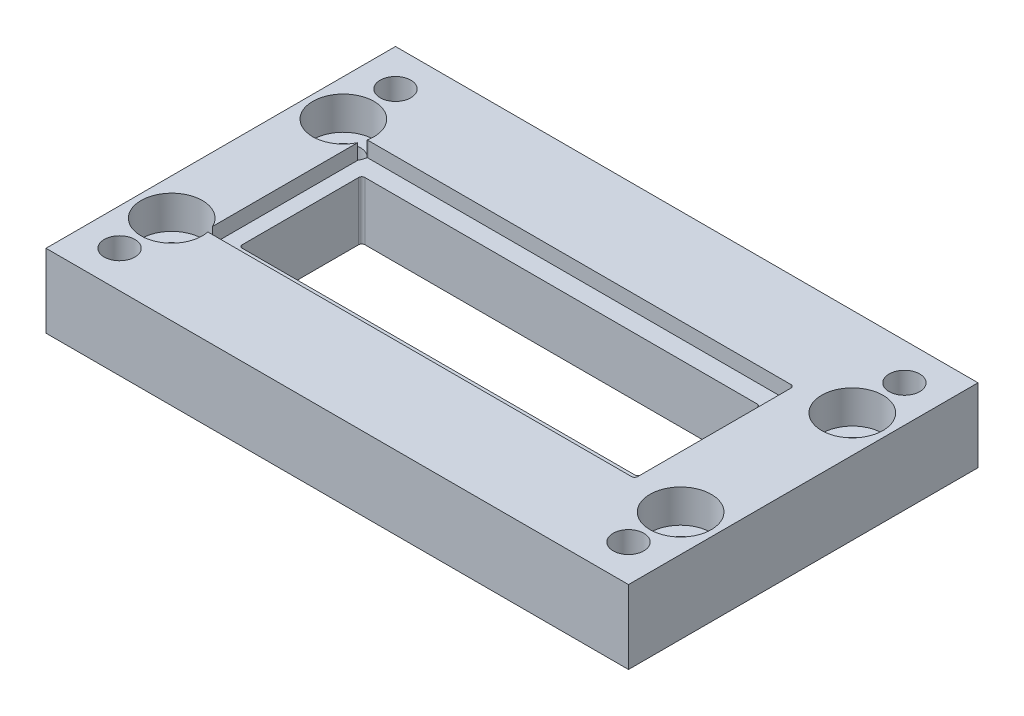
ISO-10303-21;
HEADER;
FILE_DESCRIPTION(('STEP AP214'),'2;1');
FILE_NAME('part.step','',(''),(''),'','','');
FILE_SCHEMA(('AUTOMOTIVE_DESIGN { 1 0 10303 214 1 1 1 1 }'));
ENDSEC;
DATA;
#1=APPLICATION_CONTEXT('core data for automotive mechanical design processes');
#2=APPLICATION_PROTOCOL_DEFINITION('international standard','automotive_design',2000,#1);
#3=PRODUCT_CONTEXT('',#1,'mechanical');
#4=PRODUCT('Part','Part','',(#3));
#5=PRODUCT_RELATED_PRODUCT_CATEGORY('part','',(#4));
#6=PRODUCT_DEFINITION_FORMATION('','',#4);
#7=PRODUCT_DEFINITION_CONTEXT('part definition',#1,'design');
#8=PRODUCT_DEFINITION('design','',#6,#7);
#9=PRODUCT_DEFINITION_SHAPE('','',#8);
#10=(LENGTH_UNIT() NAMED_UNIT(*) SI_UNIT(.MILLI.,.METRE.));
#11=(NAMED_UNIT(*) PLANE_ANGLE_UNIT() SI_UNIT($,.RADIAN.));
#12=(NAMED_UNIT(*) SI_UNIT($,.STERADIAN.) SOLID_ANGLE_UNIT());
#13=UNCERTAINTY_MEASURE_WITH_UNIT(LENGTH_MEASURE(1.E-05),#10,'distance_accuracy_value','');
#14=(GEOMETRIC_REPRESENTATION_CONTEXT(3) GLOBAL_UNCERTAINTY_ASSIGNED_CONTEXT((#13)) GLOBAL_UNIT_ASSIGNED_CONTEXT((#10,
#11,#12)) REPRESENTATION_CONTEXT('',''));
#15=CARTESIAN_POINT('',(0.,0.,0.));
#16=DIRECTION('',(0.,0.,1.));
#17=DIRECTION('',(1.,0.,0.));
#18=AXIS2_PLACEMENT_3D('',#15,#16,#17);
#19=CARTESIAN_POINT('',(-37.,12.,0.));
#20=DIRECTION('',(1.,0.,0.));
#21=DIRECTION('',(0.,0.,-1.));
#22=AXIS2_PLACEMENT_3D('',#19,#20,#21);
#23=PLANE('',#22);
#24=DIRECTION('',(0.,1.,0.));
#25=VECTOR('',#24,1.);
#26=CARTESIAN_POINT('',(-37.,12.,-11.8205505282297));
#27=LINE('',#26,#25);
#28=CARTESIAN_POINT('',(-37.,12.,-11.8205505282297));
#29=VERTEX_POINT('',#28);
#30=CARTESIAN_POINT('',(-37.,9.5,-11.8205505282297));
#31=VERTEX_POINT('',#30);
#32=EDGE_CURVE('E48',#29,#31,#27,.F.);
#33=ORIENTED_EDGE('',*,*,#32,.F.);
#34=DIRECTION('',(0.,0.,1.));
#35=VECTOR('',#34,1.);
#36=CARTESIAN_POINT('',(-37.,12.,0.));
#37=LINE('',#36,#35);
#38=CARTESIAN_POINT('',(-37.,12.,11.8205505282297));
#39=VERTEX_POINT('',#38);
#40=EDGE_CURVE('E55',#29,#39,#37,.T.);
#41=ORIENTED_EDGE('',*,*,#40,.T.);
#42=DIRECTION('',(0.,1.,0.));
#43=VECTOR('',#42,1.);
#44=CARTESIAN_POINT('',(-37.,12.,11.8205505282297));
#45=LINE('',#44,#43);
#46=CARTESIAN_POINT('',(-37.,9.5,11.8205505282297));
#47=VERTEX_POINT('',#46);
#48=EDGE_CURVE('E272',#47,#39,#45,.T.);
#49=ORIENTED_EDGE('',*,*,#48,.F.);
#50=DIRECTION('',(0.,0.,1.));
#51=VECTOR('',#50,1.);
#52=CARTESIAN_POINT('',(-37.,9.5,0.));
#53=LINE('',#52,#51);
#54=EDGE_CURVE('E191',#31,#47,#53,.T.);
#55=ORIENTED_EDGE('',*,*,#54,.F.);
#56=EDGE_LOOP('',(#33,#41,#49,#55));
#57=FACE_BOUND('',#56,.T.);
#58=ADVANCED_FACE('F34',(#57),#23,.T.);
#59=CARTESIAN_POINT('',(-36.5,12.,-12.5));
#60=DIRECTION('',(0.,-1.,0.));
#61=DIRECTION('',(0.,0.,-1.));
#62=AXIS2_PLACEMENT_3D('',#59,#60,#61);
#63=CYLINDRICAL_SURFACE('',#62,0.500000000000003);
#64=CARTESIAN_POINT('',(-36.5,12.,-12.5));
#65=DIRECTION('',(0.,1.,0.));
#66=DIRECTION('',(0.,0.,1.));
#67=AXIS2_PLACEMENT_3D('',#64,#65,#66);
#68=CIRCLE('',#67,0.500000000000003);
#69=CARTESIAN_POINT('',(-36.6032318616067,12.,-12.9892271279776));
#70=VERTEX_POINT('',#69);
#71=CARTESIAN_POINT('',(-36.5,12.,-13.));
#72=VERTEX_POINT('',#71);
#73=EDGE_CURVE('E199',#70,#72,#68,.F.);
#74=ORIENTED_EDGE('',*,*,#73,.F.);
#75=DIRECTION('',(0.,1.,0.));
#76=VECTOR('',#75,1.);
#77=CARTESIAN_POINT('',(-36.6032318616067,9.3,-12.9892271279776));
#78=LINE('',#77,#76);
#79=CARTESIAN_POINT('',(-36.6032318616067,9.5,-12.9892271279776));
#80=VERTEX_POINT('',#79);
#81=EDGE_CURVE('E184',#70,#80,#78,.F.);
#82=ORIENTED_EDGE('',*,*,#81,.T.);
#83=CARTESIAN_POINT('',(-36.5,9.5,-12.5));
#84=DIRECTION('',(0.,1.,0.));
#85=DIRECTION('',(0.,0.,1.));
#86=AXIS2_PLACEMENT_3D('',#83,#84,#85);
#87=CIRCLE('',#86,0.500000000000003);
#88=CARTESIAN_POINT('',(-36.5,9.5,-13.));
#89=VERTEX_POINT('',#88);
#90=EDGE_CURVE('E308',#80,#89,#87,.F.);
#91=ORIENTED_EDGE('',*,*,#90,.T.);
#92=DIRECTION('',(0.,-1.,0.));
#93=VECTOR('',#92,1.);
#94=CARTESIAN_POINT('',(-36.5,12.,-13.));
#95=LINE('',#94,#93);
#96=EDGE_CURVE('E255',#72,#89,#95,.T.);
#97=ORIENTED_EDGE('',*,*,#96,.F.);
#98=EDGE_LOOP('',(#74,#82,#91,#97));
#99=FACE_BOUND('',#98,.T.);
#100=ADVANCED_FACE('F436',(#99),#63,.F.);
#101=CARTESIAN_POINT('',(0.,12.,-13.));
#102=DIRECTION('',(0.,0.,1.));
#103=DIRECTION('',(1.,0.,0.));
#104=AXIS2_PLACEMENT_3D('',#101,#102,#103);
#105=PLANE('',#104);
#106=DIRECTION('',(-1.,0.,0.));
#107=VECTOR('',#106,1.);
#108=CARTESIAN_POINT('',(0.,9.5,-13.));
#109=LINE('',#108,#107);
#110=CARTESIAN_POINT('',(32.5,9.5,-13.));
#111=VERTEX_POINT('',#110);
#112=EDGE_CURVE('E324',#111,#89,#109,.T.);
#113=ORIENTED_EDGE('',*,*,#112,.F.);
#114=DIRECTION('',(0.,-1.,0.));
#115=VECTOR('',#114,1.);
#116=CARTESIAN_POINT('',(32.5,12.,-13.));
#117=LINE('',#116,#115);
#118=CARTESIAN_POINT('',(32.5,12.,-13.));
#119=VERTEX_POINT('',#118);
#120=EDGE_CURVE('E252',#119,#111,#117,.T.);
#121=ORIENTED_EDGE('',*,*,#120,.F.);
#122=DIRECTION('',(-1.,0.,0.));
#123=VECTOR('',#122,1.);
#124=CARTESIAN_POINT('',(0.,12.,-13.));
#125=LINE('',#124,#123);
#126=EDGE_CURVE('E202',#119,#72,#125,.T.);
#127=ORIENTED_EDGE('',*,*,#126,.T.);
#128=ORIENTED_EDGE('',*,*,#96,.T.);
#129=EDGE_LOOP('',(#113,#121,#127,#128));
#130=FACE_BOUND('',#129,.T.);
#131=ADVANCED_FACE('F441',(#130),#105,.T.);
#132=CARTESIAN_POINT('',(32.5,12.,-12.5));
#133=DIRECTION('',(0.,-1.,0.));
#134=DIRECTION('',(0.,0.,-1.));
#135=AXIS2_PLACEMENT_3D('',#132,#133,#134);
#136=CYLINDRICAL_SURFACE('',#135,0.5);
#137=ORIENTED_EDGE('',*,*,#120,.T.);
#138=CARTESIAN_POINT('',(32.5,9.5,-12.5));
#139=DIRECTION('',(0.,1.,0.));
#140=DIRECTION('',(0.,0.,1.));
#141=AXIS2_PLACEMENT_3D('',#138,#139,#140);
#142=CIRCLE('',#141,0.5);
#143=CARTESIAN_POINT('',(33.,9.5,-12.5));
#144=VERTEX_POINT('',#143);
#145=EDGE_CURVE('E321',#111,#144,#142,.F.);
#146=ORIENTED_EDGE('',*,*,#145,.T.);
#147=DIRECTION('',(0.,-1.,0.));
#148=VECTOR('',#147,1.);
#149=CARTESIAN_POINT('',(33.,12.,-12.5));
#150=LINE('',#149,#148);
#151=CARTESIAN_POINT('',(33.,12.,-12.5));
#152=VERTEX_POINT('',#151);
#153=EDGE_CURVE('E249',#152,#144,#150,.T.);
#154=ORIENTED_EDGE('',*,*,#153,.F.);
#155=CARTESIAN_POINT('',(32.5,12.,-12.5));
#156=DIRECTION('',(0.,1.,0.));
#157=DIRECTION('',(0.,0.,1.));
#158=AXIS2_PLACEMENT_3D('',#155,#156,#157);
#159=CIRCLE('',#158,0.5);
#160=EDGE_CURVE('E211',#119,#152,#159,.F.);
#161=ORIENTED_EDGE('',*,*,#160,.F.);
#162=EDGE_LOOP('',(#137,#146,#154,#161));
#163=FACE_BOUND('',#162,.T.);
#164=ADVANCED_FACE('F471',(#163),#136,.F.);
#165=CARTESIAN_POINT('',(33.,12.,0.));
#166=DIRECTION('',(1.,0.,0.));
#167=DIRECTION('',(0.,0.,-1.));
#168=AXIS2_PLACEMENT_3D('',#165,#166,#167);
#169=PLANE('',#168);
#170=ORIENTED_EDGE('',*,*,#153,.T.);
#171=DIRECTION('',(0.,0.,1.));
#172=VECTOR('',#171,1.);
#173=CARTESIAN_POINT('',(33.,9.5,0.));
#174=LINE('',#173,#172);
#175=CARTESIAN_POINT('',(33.,9.5,12.5));
#176=VERTEX_POINT('',#175);
#177=EDGE_CURVE('E318',#144,#176,#174,.T.);
#178=ORIENTED_EDGE('',*,*,#177,.T.);
#179=DIRECTION('',(0.,-1.,0.));
#180=VECTOR('',#179,1.);
#181=CARTESIAN_POINT('',(33.,12.,12.5));
#182=LINE('',#181,#180);
#183=CARTESIAN_POINT('',(33.,12.,12.5));
#184=VERTEX_POINT('',#183);
#185=EDGE_CURVE('E246',#184,#176,#182,.T.);
#186=ORIENTED_EDGE('',*,*,#185,.F.);
#187=DIRECTION('',(0.,0.,1.));
#188=VECTOR('',#187,1.);
#189=CARTESIAN_POINT('',(33.,12.,0.));
#190=LINE('',#189,#188);
#191=EDGE_CURVE('E214',#152,#184,#190,.T.);
#192=ORIENTED_EDGE('',*,*,#191,.F.);
#193=EDGE_LOOP('',(#170,#178,#186,#192));
#194=FACE_BOUND('',#193,.T.);
#195=ADVANCED_FACE('F464',(#194),#169,.F.);
#196=CARTESIAN_POINT('',(32.5,12.,12.5));
#197=DIRECTION('',(0.,-1.,0.));
#198=DIRECTION('',(0.,0.,-1.));
#199=AXIS2_PLACEMENT_3D('',#196,#197,#198);
#200=CYLINDRICAL_SURFACE('',#199,0.5);
#201=CARTESIAN_POINT('',(32.5,9.5,12.5));
#202=DIRECTION('',(0.,1.,0.));
#203=DIRECTION('',(0.,0.,1.));
#204=AXIS2_PLACEMENT_3D('',#201,#202,#203);
#205=CIRCLE('',#204,0.5);
#206=CARTESIAN_POINT('',(32.5,9.5,13.));
#207=VERTEX_POINT('',#206);
#208=EDGE_CURVE('E316',#207,#176,#205,.T.);
#209=ORIENTED_EDGE('',*,*,#208,.F.);
#210=DIRECTION('',(0.,-1.,0.));
#211=VECTOR('',#210,1.);
#212=CARTESIAN_POINT('',(32.5,12.,13.));
#213=LINE('',#212,#211);
#214=CARTESIAN_POINT('',(32.5,12.,13.));
#215=VERTEX_POINT('',#214);
#216=EDGE_CURVE('E242',#215,#207,#213,.T.);
#217=ORIENTED_EDGE('',*,*,#216,.F.);
#218=CARTESIAN_POINT('',(32.5,12.,12.5));
#219=DIRECTION('',(0.,1.,0.));
#220=DIRECTION('',(0.,0.,1.));
#221=AXIS2_PLACEMENT_3D('',#218,#219,#220);
#222=CIRCLE('',#221,0.5);
#223=EDGE_CURVE('E216',#215,#184,#222,.T.);
#224=ORIENTED_EDGE('',*,*,#223,.T.);
#225=ORIENTED_EDGE('',*,*,#185,.T.);
#226=EDGE_LOOP('',(#209,#217,#224,#225));
#227=FACE_BOUND('',#226,.T.);
#228=ADVANCED_FACE('F458',(#227),#200,.F.);
#229=CARTESIAN_POINT('',(0.,12.,13.));
#230=DIRECTION('',(0.,0.,1.));
#231=DIRECTION('',(1.,0.,0.));
#232=AXIS2_PLACEMENT_3D('',#229,#230,#231);
#233=PLANE('',#232);
#234=ORIENTED_EDGE('',*,*,#216,.T.);
#235=DIRECTION('',(-1.,0.,0.));
#236=VECTOR('',#235,1.);
#237=CARTESIAN_POINT('',(0.,9.5,13.));
#238=LINE('',#237,#236);
#239=CARTESIAN_POINT('',(-36.5,9.5,13.));
#240=VERTEX_POINT('',#239);
#241=EDGE_CURVE('E313',#207,#240,#238,.T.);
#242=ORIENTED_EDGE('',*,*,#241,.T.);
#243=DIRECTION('',(0.,-1.,0.));
#244=VECTOR('',#243,1.);
#245=CARTESIAN_POINT('',(-36.5,12.,13.));
#246=LINE('',#245,#244);
#247=CARTESIAN_POINT('',(-36.5,12.,13.));
#248=VERTEX_POINT('',#247);
#249=EDGE_CURVE('E239',#248,#240,#246,.T.);
#250=ORIENTED_EDGE('',*,*,#249,.F.);
#251=DIRECTION('',(-1.,0.,0.));
#252=VECTOR('',#251,1.);
#253=CARTESIAN_POINT('',(0.,12.,13.));
#254=LINE('',#253,#252);
#255=EDGE_CURVE('E219',#215,#248,#254,.T.);
#256=ORIENTED_EDGE('',*,*,#255,.F.);
#257=EDGE_LOOP('',(#234,#242,#250,#256));
#258=FACE_BOUND('',#257,.T.);
#259=ADVANCED_FACE('F454',(#258),#233,.F.);
#260=CARTESIAN_POINT('',(0.,12.,-28.5));
#261=DIRECTION('',(0.,0.,1.));
#262=DIRECTION('',(1.,0.,0.));
#263=AXIS2_PLACEMENT_3D('',#260,#261,#262);
#264=PLANE('',#263);
#265=DIRECTION('',(-1.,0.,0.));
#266=VECTOR('',#265,1.);
#267=CARTESIAN_POINT('',(0.,0.,-28.5));
#268=LINE('',#267,#266);
#269=CARTESIAN_POINT('',(47.5,0.,-28.5));
#270=VERTEX_POINT('',#269);
#271=CARTESIAN_POINT('',(-47.5,0.,-28.5));
#272=VERTEX_POINT('',#271);
#273=EDGE_CURVE('E225',#270,#272,#268,.T.);
#274=ORIENTED_EDGE('',*,*,#273,.T.);
#275=DIRECTION('',(0.,-1.,0.));
#276=VECTOR('',#275,1.);
#277=CARTESIAN_POINT('',(-47.5,12.,-28.5));
#278=LINE('',#277,#276);
#279=CARTESIAN_POINT('',(-47.5,12.,-28.5));
#280=VERTEX_POINT('',#279);
#281=EDGE_CURVE('E243',#280,#272,#278,.T.);
#282=ORIENTED_EDGE('',*,*,#281,.F.);
#283=DIRECTION('',(-1.,0.,0.));
#284=VECTOR('',#283,1.);
#285=CARTESIAN_POINT('',(0.,12.,-28.5));
#286=LINE('',#285,#284);
#287=CARTESIAN_POINT('',(47.5,12.,-28.5));
#288=VERTEX_POINT('',#287);
#289=EDGE_CURVE('E238',#288,#280,#286,.T.);
#290=ORIENTED_EDGE('',*,*,#289,.F.);
#291=DIRECTION('',(0.,-1.,0.));
#292=VECTOR('',#291,1.);
#293=CARTESIAN_POINT('',(47.5,12.,-28.5));
#294=LINE('',#293,#292);
#295=EDGE_CURVE('E224',#288,#270,#294,.T.);
#296=ORIENTED_EDGE('',*,*,#295,.T.);
#297=EDGE_LOOP('',(#274,#282,#290,#296));
#298=FACE_BOUND('',#297,.T.);
#299=ADVANCED_FACE('F36',(#298),#264,.F.);
#300=CARTESIAN_POINT('',(-47.5,12.,0.));
#301=DIRECTION('',(1.,0.,0.));
#302=DIRECTION('',(0.,0.,-1.));
#303=AXIS2_PLACEMENT_3D('',#300,#301,#302);
#304=PLANE('',#303);
#305=DIRECTION('',(0.,0.,1.));
#306=VECTOR('',#305,1.);
#307=CARTESIAN_POINT('',(-47.5,0.,0.));
#308=LINE('',#307,#306);
#309=CARTESIAN_POINT('',(-47.5,0.,28.5));
#310=VERTEX_POINT('',#309);
#311=EDGE_CURVE('E228',#272,#310,#308,.T.);
#312=ORIENTED_EDGE('',*,*,#311,.T.);
#313=DIRECTION('',(0.,-1.,0.));
#314=VECTOR('',#313,1.);
#315=CARTESIAN_POINT('',(-47.5,12.,28.5));
#316=LINE('',#315,#314);
#317=CARTESIAN_POINT('',(-47.5,12.,28.5));
#318=VERTEX_POINT('',#317);
#319=EDGE_CURVE('E261',#318,#310,#316,.T.);
#320=ORIENTED_EDGE('',*,*,#319,.F.);
#321=DIRECTION('',(0.,0.,1.));
#322=VECTOR('',#321,1.);
#323=CARTESIAN_POINT('',(-47.5,12.,0.));
#324=LINE('',#323,#322);
#325=EDGE_CURVE('E363',#280,#318,#324,.T.);
#326=ORIENTED_EDGE('',*,*,#325,.F.);
#327=ORIENTED_EDGE('',*,*,#281,.T.);
#328=EDGE_LOOP('',(#312,#320,#326,#327));
#329=FACE_BOUND('',#328,.T.);
#330=ADVANCED_FACE('F380',(#329),#304,.F.);
#331=CARTESIAN_POINT('',(0.,12.,28.5));
#332=DIRECTION('',(0.,0.,1.));
#333=DIRECTION('',(1.,0.,0.));
#334=AXIS2_PLACEMENT_3D('',#331,#332,#333);
#335=PLANE('',#334);
#336=DIRECTION('',(-1.,0.,0.));
#337=VECTOR('',#336,1.);
#338=CARTESIAN_POINT('',(0.,0.,28.5));
#339=LINE('',#338,#337);
#340=CARTESIAN_POINT('',(47.5,0.,28.5));
#341=VERTEX_POINT('',#340);
#342=EDGE_CURVE('E232',#341,#310,#339,.T.);
#343=ORIENTED_EDGE('',*,*,#342,.F.);
#344=DIRECTION('',(0.,-1.,0.));
#345=VECTOR('',#344,1.);
#346=CARTESIAN_POINT('',(47.5,12.,28.5));
#347=LINE('',#346,#345);
#348=CARTESIAN_POINT('',(47.5,12.,28.5));
#349=VERTEX_POINT('',#348);
#350=EDGE_CURVE('E259',#349,#341,#347,.T.);
#351=ORIENTED_EDGE('',*,*,#350,.F.);
#352=DIRECTION('',(-1.,0.,0.));
#353=VECTOR('',#352,1.);
#354=CARTESIAN_POINT('',(0.,12.,28.5));
#355=LINE('',#354,#353);
#356=EDGE_CURVE('E205',#349,#318,#355,.T.);
#357=ORIENTED_EDGE('',*,*,#356,.T.);
#358=ORIENTED_EDGE('',*,*,#319,.T.);
#359=EDGE_LOOP('',(#343,#351,#357,#358));
#360=FACE_BOUND('',#359,.T.);
#361=ADVANCED_FACE('F368',(#360),#335,.T.);
#362=CARTESIAN_POINT('',(47.5,12.,0.));
#363=DIRECTION('',(1.,0.,0.));
#364=DIRECTION('',(0.,0.,-1.));
#365=AXIS2_PLACEMENT_3D('',#362,#363,#364);
#366=PLANE('',#365);
#367=DIRECTION('',(0.,0.,1.));
#368=VECTOR('',#367,1.);
#369=CARTESIAN_POINT('',(47.5,0.,0.));
#370=LINE('',#369,#368);
#371=EDGE_CURVE('E235',#270,#341,#370,.T.);
#372=ORIENTED_EDGE('',*,*,#371,.F.);
#373=ORIENTED_EDGE('',*,*,#295,.F.);
#374=DIRECTION('',(0.,0.,1.));
#375=VECTOR('',#374,1.);
#376=CARTESIAN_POINT('',(47.5,12.,0.));
#377=LINE('',#376,#375);
#378=EDGE_CURVE('E200',#288,#349,#377,.T.);
#379=ORIENTED_EDGE('',*,*,#378,.T.);
#380=ORIENTED_EDGE('',*,*,#350,.T.);
#381=EDGE_LOOP('',(#372,#373,#379,#380));
#382=FACE_BOUND('',#381,.T.);
#383=ADVANCED_FACE('F374',(#382),#366,.T.);
#384=CARTESIAN_POINT('',(-36.5,12.,12.5));
#385=DIRECTION('',(0.,-1.,0.));
#386=DIRECTION('',(0.,0.,-1.));
#387=AXIS2_PLACEMENT_3D('',#384,#385,#386);
#388=CYLINDRICAL_SURFACE('',#387,0.5);
#389=CARTESIAN_POINT('',(-36.5,9.5,12.5));
#390=DIRECTION('',(0.,1.,0.));
#391=DIRECTION('',(0.,0.,1.));
#392=AXIS2_PLACEMENT_3D('',#389,#390,#391);
#393=CIRCLE('',#392,0.5);
#394=CARTESIAN_POINT('',(-36.6032318616067,9.5,12.9892271279776));
#395=VERTEX_POINT('',#394);
#396=EDGE_CURVE('E311',#240,#395,#393,.F.);
#397=ORIENTED_EDGE('',*,*,#396,.T.);
#398=DIRECTION('',(0.,1.,0.));
#399=VECTOR('',#398,1.);
#400=CARTESIAN_POINT('',(-36.6032318616067,9.3,12.9892271279776));
#401=LINE('',#400,#399);
#402=CARTESIAN_POINT('',(-36.6032318616067,12.,12.9892271279776));
#403=VERTEX_POINT('',#402);
#404=EDGE_CURVE('E265',#395,#403,#401,.T.);
#405=ORIENTED_EDGE('',*,*,#404,.T.);
#406=CARTESIAN_POINT('',(-36.5,12.,12.5));
#407=DIRECTION('',(0.,1.,0.));
#408=DIRECTION('',(0.,0.,1.));
#409=AXIS2_PLACEMENT_3D('',#406,#407,#408);
#410=CIRCLE('',#409,0.5);
#411=EDGE_CURVE('E222',#248,#403,#410,.F.);
#412=ORIENTED_EDGE('',*,*,#411,.F.);
#413=ORIENTED_EDGE('',*,*,#249,.T.);
#414=EDGE_LOOP('',(#397,#405,#412,#413));
#415=FACE_BOUND('',#414,.T.);
#416=ADVANCED_FACE('F448',(#415),#388,.F.);
#417=CARTESIAN_POINT('',(0.,12.,0.));
#418=DIRECTION('',(0.,1.,0.));
#419=DIRECTION('',(0.,0.,1.));
#420=AXIS2_PLACEMENT_3D('',#417,#418,#419);
#421=PLANE('',#420);
#422=CARTESIAN_POINT('',(-41.5,12.,-22.5));
#423=DIRECTION('',(0.,1.,0.));
#424=DIRECTION('',(0.,0.,1.));
#425=AXIS2_PLACEMENT_3D('',#422,#423,#424);
#426=CIRCLE('',#425,2.5);
#427=CARTESIAN_POINT('',(-41.5,12.,-20.));
#428=VERTEX_POINT('',#427);
#429=EDGE_CURVE('E586',#428,#428,#426,.T.);
#430=ORIENTED_EDGE('',*,*,#429,.F.);
#431=EDGE_LOOP('',(#430));
#432=FACE_BOUND('',#431,.T.);
#433=CARTESIAN_POINT('',(41.5,12.,-22.5));
#434=DIRECTION('',(0.,1.,0.));
#435=DIRECTION('',(0.,0.,1.));
#436=AXIS2_PLACEMENT_3D('',#433,#434,#435);
#437=CIRCLE('',#436,2.5);
#438=CARTESIAN_POINT('',(41.5,12.,-20.));
#439=VERTEX_POINT('',#438);
#440=EDGE_CURVE('E589',#439,#439,#437,.T.);
#441=ORIENTED_EDGE('',*,*,#440,.F.);
#442=EDGE_LOOP('',(#441));
#443=FACE_BOUND('',#442,.T.);
#444=CARTESIAN_POINT('',(41.5,12.,22.5));
#445=DIRECTION('',(0.,1.,0.));
#446=DIRECTION('',(0.,0.,1.));
#447=AXIS2_PLACEMENT_3D('',#444,#445,#446);
#448=CIRCLE('',#447,2.5);
#449=CARTESIAN_POINT('',(41.5,12.,25.));
#450=VERTEX_POINT('',#449);
#451=EDGE_CURVE('E597',#450,#450,#448,.T.);
#452=ORIENTED_EDGE('',*,*,#451,.F.);
#453=EDGE_LOOP('',(#452));
#454=FACE_BOUND('',#453,.T.);
#455=CARTESIAN_POINT('',(-41.5,12.,22.5));
#456=DIRECTION('',(0.,1.,0.));
#457=DIRECTION('',(0.,0.,1.));
#458=AXIS2_PLACEMENT_3D('',#455,#456,#457);
#459=CIRCLE('',#458,2.5);
#460=CARTESIAN_POINT('',(-41.5,12.,25.));
#461=VERTEX_POINT('',#460);
#462=EDGE_CURVE('E603',#461,#461,#459,.T.);
#463=ORIENTED_EDGE('',*,*,#462,.F.);
#464=EDGE_LOOP('',(#463));
#465=FACE_BOUND('',#464,.T.);
#466=CARTESIAN_POINT('',(-41.5,12.,-14.));
#467=DIRECTION('',(0.,1.,0.));
#468=DIRECTION('',(0.,0.,1.));
#469=AXIS2_PLACEMENT_3D('',#466,#467,#468);
#470=CIRCLE('',#469,5.);
#471=EDGE_CURVE('E181',#70,#29,#470,.T.);
#472=ORIENTED_EDGE('',*,*,#471,.F.);
#473=ORIENTED_EDGE('',*,*,#73,.T.);
#474=ORIENTED_EDGE('',*,*,#126,.F.);
#475=ORIENTED_EDGE('',*,*,#160,.T.);
#476=ORIENTED_EDGE('',*,*,#191,.T.);
#477=ORIENTED_EDGE('',*,*,#223,.F.);
#478=ORIENTED_EDGE('',*,*,#255,.T.);
#479=ORIENTED_EDGE('',*,*,#411,.T.);
#480=CARTESIAN_POINT('',(-41.5,12.,14.));
#481=DIRECTION('',(0.,1.,0.));
#482=DIRECTION('',(0.,0.,1.));
#483=AXIS2_PLACEMENT_3D('',#480,#481,#482);
#484=CIRCLE('',#483,5.);
#485=EDGE_CURVE('E198',#39,#403,#484,.T.);
#486=ORIENTED_EDGE('',*,*,#485,.F.);
#487=ORIENTED_EDGE('',*,*,#40,.F.);
#488=EDGE_LOOP('',(#472,#473,#474,#475,#476,#477,#478,#479,#486,#487));
#489=FACE_BOUND('',#488,.T.);
#490=CARTESIAN_POINT('',(41.5,12.,-14.));
#491=DIRECTION('',(0.,1.,0.));
#492=DIRECTION('',(0.,0.,1.));
#493=AXIS2_PLACEMENT_3D('',#490,#491,#492);
#494=CIRCLE('',#493,5.);
#495=CARTESIAN_POINT('',(41.5,12.,-9.00000000000001));
#496=VERTEX_POINT('',#495);
#497=EDGE_CURVE('E485',#496,#496,#494,.T.);
#498=ORIENTED_EDGE('',*,*,#497,.F.);
#499=EDGE_LOOP('',(#498));
#500=FACE_BOUND('',#499,.T.);
#501=CARTESIAN_POINT('',(41.5,12.,14.));
#502=DIRECTION('',(0.,1.,0.));
#503=DIRECTION('',(0.,0.,1.));
#504=AXIS2_PLACEMENT_3D('',#501,#502,#503);
#505=CIRCLE('',#504,5.);
#506=CARTESIAN_POINT('',(41.5,12.,19.));
#507=VERTEX_POINT('',#506);
#508=EDGE_CURVE('E500',#507,#507,#505,.T.);
#509=ORIENTED_EDGE('',*,*,#508,.F.);
#510=EDGE_LOOP('',(#509));
#511=FACE_BOUND('',#510,.T.);
#512=ORIENTED_EDGE('',*,*,#289,.T.);
#513=ORIENTED_EDGE('',*,*,#325,.T.);
#514=ORIENTED_EDGE('',*,*,#356,.F.);
#515=ORIENTED_EDGE('',*,*,#378,.F.);
#516=EDGE_LOOP('',(#512,#513,#514,#515));
#517=FACE_BOUND('',#516,.T.);
#518=ADVANCED_FACE('F195',(#432,#443,#454,#465,#489,#500,#511,#517),#421,.T.);
#519=CARTESIAN_POINT('',(0.,0.,0.));
#520=DIRECTION('',(0.,1.,0.));
#521=DIRECTION('',(0.,0.,1.));
#522=AXIS2_PLACEMENT_3D('',#519,#520,#521);
#523=PLANE('',#522);
#524=CARTESIAN_POINT('',(-41.5,0.,-22.5));
#525=DIRECTION('',(0.,1.,0.));
#526=DIRECTION('',(0.,0.,1.));
#527=AXIS2_PLACEMENT_3D('',#524,#525,#526);
#528=CIRCLE('',#527,2.5);
#529=CARTESIAN_POINT('',(-41.5,0.,-20.));
#530=VERTEX_POINT('',#529);
#531=EDGE_CURVE('E583',#530,#530,#528,.T.);
#532=ORIENTED_EDGE('',*,*,#531,.T.);
#533=EDGE_LOOP('',(#532));
#534=FACE_BOUND('',#533,.T.);
#535=CARTESIAN_POINT('',(41.5,0.,-22.5));
#536=DIRECTION('',(0.,1.,0.));
#537=DIRECTION('',(0.,0.,1.));
#538=AXIS2_PLACEMENT_3D('',#535,#536,#537);
#539=CIRCLE('',#538,2.5);
#540=CARTESIAN_POINT('',(41.5,0.,-20.));
#541=VERTEX_POINT('',#540);
#542=EDGE_CURVE('E594',#541,#541,#539,.T.);
#543=ORIENTED_EDGE('',*,*,#542,.T.);
#544=EDGE_LOOP('',(#543));
#545=FACE_BOUND('',#544,.T.);
#546=CARTESIAN_POINT('',(41.5,0.,22.5));
#547=DIRECTION('',(0.,1.,0.));
#548=DIRECTION('',(0.,0.,1.));
#549=AXIS2_PLACEMENT_3D('',#546,#547,#548);
#550=CIRCLE('',#549,2.5);
#551=CARTESIAN_POINT('',(41.5,0.,25.));
#552=VERTEX_POINT('',#551);
#553=EDGE_CURVE('E600',#552,#552,#550,.T.);
#554=ORIENTED_EDGE('',*,*,#553,.T.);
#555=EDGE_LOOP('',(#554));
#556=FACE_BOUND('',#555,.T.);
#557=CARTESIAN_POINT('',(-41.5,0.,22.5));
#558=DIRECTION('',(0.,1.,0.));
#559=DIRECTION('',(0.,0.,1.));
#560=AXIS2_PLACEMENT_3D('',#557,#558,#559);
#561=CIRCLE('',#560,2.5);
#562=CARTESIAN_POINT('',(-41.5,0.,25.));
#563=VERTEX_POINT('',#562);
#564=EDGE_CURVE('E188',#563,#563,#561,.T.);
#565=ORIENTED_EDGE('',*,*,#564,.T.);
#566=EDGE_LOOP('',(#565));
#567=FACE_BOUND('',#566,.T.);
#568=CARTESIAN_POINT('',(-41.5,0.,-14.));
#569=DIRECTION('',(0.,1.,0.));
#570=DIRECTION('',(0.,0.,1.));
#571=AXIS2_PLACEMENT_3D('',#568,#569,#570);
#572=CIRCLE('',#571,2.75);
#573=CARTESIAN_POINT('',(-41.5,0.,-11.25));
#574=VERTEX_POINT('',#573);
#575=EDGE_CURVE('E192',#574,#574,#572,.T.);
#576=ORIENTED_EDGE('',*,*,#575,.T.);
#577=EDGE_LOOP('',(#576));
#578=FACE_BOUND('',#577,.T.);
#579=CARTESIAN_POINT('',(41.5,0.,-14.));
#580=DIRECTION('',(0.,1.,0.));
#581=DIRECTION('',(0.,0.,1.));
#582=AXIS2_PLACEMENT_3D('',#579,#580,#581);
#583=CIRCLE('',#582,2.75);
#584=CARTESIAN_POINT('',(41.5,0.,-11.25));
#585=VERTEX_POINT('',#584);
#586=EDGE_CURVE('E497',#585,#585,#583,.T.);
#587=ORIENTED_EDGE('',*,*,#586,.T.);
#588=EDGE_LOOP('',(#587));
#589=FACE_BOUND('',#588,.T.);
#590=CARTESIAN_POINT('',(41.5,0.,14.));
#591=DIRECTION('',(0.,1.,0.));
#592=DIRECTION('',(0.,0.,1.));
#593=AXIS2_PLACEMENT_3D('',#590,#591,#592);
#594=CIRCLE('',#593,2.75);
#595=CARTESIAN_POINT('',(41.5,0.,16.75));
#596=VERTEX_POINT('',#595);
#597=EDGE_CURVE('E509',#596,#596,#594,.T.);
#598=ORIENTED_EDGE('',*,*,#597,.T.);
#599=EDGE_LOOP('',(#598));
#600=FACE_BOUND('',#599,.T.);
#601=CARTESIAN_POINT('',(-41.5,0.,14.));
#602=DIRECTION('',(0.,1.,0.));
#603=DIRECTION('',(0.,0.,1.));
#604=AXIS2_PLACEMENT_3D('',#601,#602,#603);
#605=CIRCLE('',#604,2.75);
#606=CARTESIAN_POINT('',(-41.5,0.,16.75));
#607=VERTEX_POINT('',#606);
#608=EDGE_CURVE('E276',#607,#607,#605,.T.);
#609=ORIENTED_EDGE('',*,*,#608,.T.);
#610=EDGE_LOOP('',(#609));
#611=FACE_BOUND('',#610,.T.);
#612=ORIENTED_EDGE('',*,*,#273,.F.);
#613=ORIENTED_EDGE('',*,*,#371,.T.);
#614=ORIENTED_EDGE('',*,*,#342,.T.);
#615=ORIENTED_EDGE('',*,*,#311,.F.);
#616=EDGE_LOOP('',(#612,#613,#614,#615));
#617=FACE_BOUND('',#616,.T.);
#618=CARTESIAN_POINT('',(30.,0.,9.49999999999999));
#619=DIRECTION('',(0.,1.,0.));
#620=DIRECTION('',(0.,0.,1.));
#621=AXIS2_PLACEMENT_3D('',#618,#619,#620);
#622=CIRCLE('',#621,0.5);
#623=CARTESIAN_POINT('',(30.,0.,9.99999999999999));
#624=VERTEX_POINT('',#623);
#625=CARTESIAN_POINT('',(30.5,0.,9.49999999999999));
#626=VERTEX_POINT('',#625);
#627=EDGE_CURVE('E275',#624,#626,#622,.T.);
#628=ORIENTED_EDGE('',*,*,#627,.T.);
#629=DIRECTION('',(0.,0.,-1.));
#630=VECTOR('',#629,1.);
#631=CARTESIAN_POINT('',(30.5,0.,0.));
#632=LINE('',#631,#630);
#633=CARTESIAN_POINT('',(30.5,0.,-9.5));
#634=VERTEX_POINT('',#633);
#635=EDGE_CURVE('E290',#626,#634,#632,.T.);
#636=ORIENTED_EDGE('',*,*,#635,.T.);
#637=CARTESIAN_POINT('',(30.,0.,-9.50000000000001));
#638=DIRECTION('',(0.,1.,0.));
#639=DIRECTION('',(0.,0.,1.));
#640=AXIS2_PLACEMENT_3D('',#637,#638,#639);
#641=CIRCLE('',#640,0.5);
#642=CARTESIAN_POINT('',(30.,0.,-10.));
#643=VERTEX_POINT('',#642);
#644=EDGE_CURVE('E340',#634,#643,#641,.T.);
#645=ORIENTED_EDGE('',*,*,#644,.T.);
#646=DIRECTION('',(-1.,0.,0.));
#647=VECTOR('',#646,1.);
#648=CARTESIAN_POINT('',(0.,0.,-10.));
#649=LINE('',#648,#647);
#650=CARTESIAN_POINT('',(-34.,0.,-10.));
#651=VERTEX_POINT('',#650);
#652=EDGE_CURVE('E337',#643,#651,#649,.T.);
#653=ORIENTED_EDGE('',*,*,#652,.T.);
#654=CARTESIAN_POINT('',(-34.,0.,-9.5));
#655=DIRECTION('',(0.,1.,0.));
#656=DIRECTION('',(0.,0.,1.));
#657=AXIS2_PLACEMENT_3D('',#654,#655,#656);
#658=CIRCLE('',#657,0.5);
#659=CARTESIAN_POINT('',(-34.5,0.,-9.49999999999999));
#660=VERTEX_POINT('',#659);
#661=EDGE_CURVE('E334',#651,#660,#658,.T.);
#662=ORIENTED_EDGE('',*,*,#661,.T.);
#663=DIRECTION('',(0.,0.,-1.));
#664=VECTOR('',#663,1.);
#665=CARTESIAN_POINT('',(-34.5,0.,0.));
#666=LINE('',#665,#664);
#667=CARTESIAN_POINT('',(-34.5,0.,9.5));
#668=VERTEX_POINT('',#667);
#669=EDGE_CURVE('E331',#668,#660,#666,.T.);
#670=ORIENTED_EDGE('',*,*,#669,.F.);
#671=CARTESIAN_POINT('',(-34.,0.,9.5));
#672=DIRECTION('',(0.,1.,0.));
#673=DIRECTION('',(0.,0.,1.));
#674=AXIS2_PLACEMENT_3D('',#671,#672,#673);
#675=CIRCLE('',#674,0.5);
#676=CARTESIAN_POINT('',(-34.,0.,10.));
#677=VERTEX_POINT('',#676);
#678=EDGE_CURVE('E329',#677,#668,#675,.F.);
#679=ORIENTED_EDGE('',*,*,#678,.F.);
#680=DIRECTION('',(-1.,0.,0.));
#681=VECTOR('',#680,1.);
#682=CARTESIAN_POINT('',(0.,0.,10.));
#683=LINE('',#682,#681);
#684=EDGE_CURVE('E279',#624,#677,#683,.T.);
#685=ORIENTED_EDGE('',*,*,#684,.F.);
#686=EDGE_LOOP('',(#628,#636,#645,#653,#662,#670,#679,#685));
#687=FACE_BOUND('',#686,.T.);
#688=ADVANCED_FACE('F382',(#534,#545,#556,#567,#578,#589,#600,#611,#617,#687),#523,.F.);
#689=CARTESIAN_POINT('',(30.,9.5,9.49999999999999));
#690=DIRECTION('',(0.,-1.,0.));
#691=DIRECTION('',(0.,0.,-1.));
#692=AXIS2_PLACEMENT_3D('',#689,#690,#691);
#693=CYLINDRICAL_SURFACE('',#692,0.5);
#694=ORIENTED_EDGE('',*,*,#627,.F.);
#695=DIRECTION('',(0.,-1.,0.));
#696=VECTOR('',#695,1.);
#697=CARTESIAN_POINT('',(30.,9.5,9.99999999999999));
#698=LINE('',#697,#696);
#699=CARTESIAN_POINT('',(30.,9.5,9.99999999999999));
#700=VERTEX_POINT('',#699);
#701=EDGE_CURVE('E229',#700,#624,#698,.T.);
#702=ORIENTED_EDGE('',*,*,#701,.F.);
#703=CARTESIAN_POINT('',(30.,9.5,9.49999999999999));
#704=DIRECTION('',(0.,1.,0.));
#705=DIRECTION('',(0.,0.,1.));
#706=AXIS2_PLACEMENT_3D('',#703,#704,#705);
#707=CIRCLE('',#706,0.5);
#708=CARTESIAN_POINT('',(30.5,9.5,9.49999999999999));
#709=VERTEX_POINT('',#708);
#710=EDGE_CURVE('E286',#700,#709,#707,.T.);
#711=ORIENTED_EDGE('',*,*,#710,.T.);
#712=DIRECTION('',(0.,-1.,0.));
#713=VECTOR('',#712,1.);
#714=CARTESIAN_POINT('',(30.5,9.5,9.49999999999999));
#715=LINE('',#714,#713);
#716=EDGE_CURVE('E326',#709,#626,#715,.T.);
#717=ORIENTED_EDGE('',*,*,#716,.T.);
#718=EDGE_LOOP('',(#694,#702,#711,#717));
#719=FACE_BOUND('',#718,.T.);
#720=ADVANCED_FACE('F385',(#719),#693,.F.);
#721=CARTESIAN_POINT('',(0.,9.5,10.));
#722=DIRECTION('',(0.,0.,1.));
#723=DIRECTION('',(1.,0.,0.));
#724=AXIS2_PLACEMENT_3D('',#721,#722,#723);
#725=PLANE('',#724);
#726=ORIENTED_EDGE('',*,*,#684,.T.);
#727=DIRECTION('',(0.,-1.,0.));
#728=VECTOR('',#727,1.);
#729=CARTESIAN_POINT('',(-34.,9.5,10.));
#730=LINE('',#729,#728);
#731=CARTESIAN_POINT('',(-34.,9.5,10.));
#732=VERTEX_POINT('',#731);
#733=EDGE_CURVE('E357',#732,#677,#730,.T.);
#734=ORIENTED_EDGE('',*,*,#733,.F.);
#735=DIRECTION('',(-1.,0.,0.));
#736=VECTOR('',#735,1.);
#737=CARTESIAN_POINT('',(0.,9.5,10.));
#738=LINE('',#737,#736);
#739=EDGE_CURVE('E289',#700,#732,#738,.T.);
#740=ORIENTED_EDGE('',*,*,#739,.F.);
#741=ORIENTED_EDGE('',*,*,#701,.T.);
#742=EDGE_LOOP('',(#726,#734,#740,#741));
#743=FACE_BOUND('',#742,.T.);
#744=ADVANCED_FACE('F420',(#743),#725,.F.);
#745=CARTESIAN_POINT('',(-34.,9.5,9.5));
#746=DIRECTION('',(0.,-1.,0.));
#747=DIRECTION('',(0.,0.,-1.));
#748=AXIS2_PLACEMENT_3D('',#745,#746,#747);
#749=CYLINDRICAL_SURFACE('',#748,0.5);
#750=ORIENTED_EDGE('',*,*,#678,.T.);
#751=DIRECTION('',(0.,-1.,0.));
#752=VECTOR('',#751,1.);
#753=CARTESIAN_POINT('',(-34.5,9.5,9.5));
#754=LINE('',#753,#752);
#755=CARTESIAN_POINT('',(-34.5,9.5,9.5));
#756=VERTEX_POINT('',#755);
#757=EDGE_CURVE('E354',#756,#668,#754,.T.);
#758=ORIENTED_EDGE('',*,*,#757,.F.);
#759=CARTESIAN_POINT('',(-34.,9.5,9.5));
#760=DIRECTION('',(0.,1.,0.));
#761=DIRECTION('',(0.,0.,1.));
#762=AXIS2_PLACEMENT_3D('',#759,#760,#761);
#763=CIRCLE('',#762,0.5);
#764=EDGE_CURVE('E292',#732,#756,#763,.F.);
#765=ORIENTED_EDGE('',*,*,#764,.F.);
#766=ORIENTED_EDGE('',*,*,#733,.T.);
#767=EDGE_LOOP('',(#750,#758,#765,#766));
#768=FACE_BOUND('',#767,.T.);
#769=ADVANCED_FACE('F415',(#768),#749,.F.);
#770=CARTESIAN_POINT('',(-34.5,9.5,0.));
#771=DIRECTION('',(-1.,0.,0.));
#772=DIRECTION('',(0.,0.,1.));
#773=AXIS2_PLACEMENT_3D('',#770,#771,#772);
#774=PLANE('',#773);
#775=ORIENTED_EDGE('',*,*,#669,.T.);
#776=DIRECTION('',(0.,-1.,0.));
#777=VECTOR('',#776,1.);
#778=CARTESIAN_POINT('',(-34.5,9.5,-9.49999999999999));
#779=LINE('',#778,#777);
#780=CARTESIAN_POINT('',(-34.5,9.5,-9.49999999999999));
#781=VERTEX_POINT('',#780);
#782=EDGE_CURVE('E352',#781,#660,#779,.T.);
#783=ORIENTED_EDGE('',*,*,#782,.F.);
#784=DIRECTION('',(0.,0.,-1.));
#785=VECTOR('',#784,1.);
#786=CARTESIAN_POINT('',(-34.5,9.5,0.));
#787=LINE('',#786,#785);
#788=EDGE_CURVE('E294',#756,#781,#787,.T.);
#789=ORIENTED_EDGE('',*,*,#788,.F.);
#790=ORIENTED_EDGE('',*,*,#757,.T.);
#791=EDGE_LOOP('',(#775,#783,#789,#790));
#792=FACE_BOUND('',#791,.T.);
#793=ADVANCED_FACE('F412',(#792),#774,.F.);
#794=CARTESIAN_POINT('',(-34.,9.5,-9.5));
#795=DIRECTION('',(0.,-1.,0.));
#796=DIRECTION('',(0.,0.,-1.));
#797=AXIS2_PLACEMENT_3D('',#794,#795,#796);
#798=CYLINDRICAL_SURFACE('',#797,0.5);
#799=ORIENTED_EDGE('',*,*,#661,.F.);
#800=DIRECTION('',(0.,-1.,0.));
#801=VECTOR('',#800,1.);
#802=CARTESIAN_POINT('',(-34.,9.5,-10.));
#803=LINE('',#802,#801);
#804=CARTESIAN_POINT('',(-34.,9.5,-10.));
#805=VERTEX_POINT('',#804);
#806=EDGE_CURVE('E350',#805,#651,#803,.T.);
#807=ORIENTED_EDGE('',*,*,#806,.F.);
#808=CARTESIAN_POINT('',(-34.,9.5,-9.5));
#809=DIRECTION('',(0.,1.,0.));
#810=DIRECTION('',(0.,0.,1.));
#811=AXIS2_PLACEMENT_3D('',#808,#809,#810);
#812=CIRCLE('',#811,0.5);
#813=EDGE_CURVE('E296',#805,#781,#812,.T.);
#814=ORIENTED_EDGE('',*,*,#813,.T.);
#815=ORIENTED_EDGE('',*,*,#782,.T.);
#816=EDGE_LOOP('',(#799,#807,#814,#815));
#817=FACE_BOUND('',#816,.T.);
#818=ADVANCED_FACE('F408',(#817),#798,.F.);
#819=CARTESIAN_POINT('',(0.,9.5,-10.));
#820=DIRECTION('',(0.,0.,1.));
#821=DIRECTION('',(1.,0.,0.));
#822=AXIS2_PLACEMENT_3D('',#819,#820,#821);
#823=PLANE('',#822);
#824=ORIENTED_EDGE('',*,*,#652,.F.);
#825=DIRECTION('',(0.,-1.,0.));
#826=VECTOR('',#825,1.);
#827=CARTESIAN_POINT('',(30.,9.5,-10.));
#828=LINE('',#827,#826);
#829=CARTESIAN_POINT('',(30.,9.5,-10.));
#830=VERTEX_POINT('',#829);
#831=EDGE_CURVE('E348',#830,#643,#828,.T.);
#832=ORIENTED_EDGE('',*,*,#831,.F.);
#833=DIRECTION('',(-1.,0.,0.));
#834=VECTOR('',#833,1.);
#835=CARTESIAN_POINT('',(0.,9.5,-10.));
#836=LINE('',#835,#834);
#837=EDGE_CURVE('E299',#830,#805,#836,.T.);
#838=ORIENTED_EDGE('',*,*,#837,.T.);
#839=ORIENTED_EDGE('',*,*,#806,.T.);
#840=EDGE_LOOP('',(#824,#832,#838,#839));
#841=FACE_BOUND('',#840,.T.);
#842=ADVANCED_FACE('F404',(#841),#823,.T.);
#843=CARTESIAN_POINT('',(30.,9.5,-9.50000000000001));
#844=DIRECTION('',(0.,-1.,0.));
#845=DIRECTION('',(0.,0.,-1.));
#846=AXIS2_PLACEMENT_3D('',#843,#844,#845);
#847=CYLINDRICAL_SURFACE('',#846,0.5);
#848=ORIENTED_EDGE('',*,*,#644,.F.);
#849=DIRECTION('',(0.,-1.,0.));
#850=VECTOR('',#849,1.);
#851=CARTESIAN_POINT('',(30.5,9.5,-9.5));
#852=LINE('',#851,#850);
#853=CARTESIAN_POINT('',(30.5,9.5,-9.5));
#854=VERTEX_POINT('',#853);
#855=EDGE_CURVE('E346',#854,#634,#852,.T.);
#856=ORIENTED_EDGE('',*,*,#855,.F.);
#857=CARTESIAN_POINT('',(30.,9.5,-9.50000000000001));
#858=DIRECTION('',(0.,1.,0.));
#859=DIRECTION('',(0.,0.,1.));
#860=AXIS2_PLACEMENT_3D('',#857,#858,#859);
#861=CIRCLE('',#860,0.5);
#862=EDGE_CURVE('E302',#854,#830,#861,.T.);
#863=ORIENTED_EDGE('',*,*,#862,.T.);
#864=ORIENTED_EDGE('',*,*,#831,.T.);
#865=EDGE_LOOP('',(#848,#856,#863,#864));
#866=FACE_BOUND('',#865,.T.);
#867=ADVANCED_FACE('F399',(#866),#847,.F.);
#868=CARTESIAN_POINT('',(30.5,9.5,0.));
#869=DIRECTION('',(-1.,0.,0.));
#870=DIRECTION('',(0.,0.,1.));
#871=AXIS2_PLACEMENT_3D('',#868,#869,#870);
#872=PLANE('',#871);
#873=ORIENTED_EDGE('',*,*,#635,.F.);
#874=ORIENTED_EDGE('',*,*,#716,.F.);
#875=DIRECTION('',(0.,0.,-1.));
#876=VECTOR('',#875,1.);
#877=CARTESIAN_POINT('',(30.5,9.5,0.));
#878=LINE('',#877,#876);
#879=EDGE_CURVE('E305',#709,#854,#878,.T.);
#880=ORIENTED_EDGE('',*,*,#879,.T.);
#881=ORIENTED_EDGE('',*,*,#855,.T.);
#882=EDGE_LOOP('',(#873,#874,#880,#881));
#883=FACE_BOUND('',#882,.T.);
#884=ADVANCED_FACE('F394',(#883),#872,.T.);
#885=CARTESIAN_POINT('',(0.,9.5,0.));
#886=DIRECTION('',(0.,1.,0.));
#887=DIRECTION('',(0.,0.,1.));
#888=AXIS2_PLACEMENT_3D('',#885,#886,#887);
#889=PLANE('',#888);
#890=CARTESIAN_POINT('',(-41.5,9.5,-14.));
#891=DIRECTION('',(0.,1.,0.));
#892=DIRECTION('',(0.,0.,1.));
#893=AXIS2_PLACEMENT_3D('',#890,#891,#892);
#894=CIRCLE('',#893,5.);
#895=EDGE_CURVE('E11',#31,#80,#894,.T.);
#896=ORIENTED_EDGE('',*,*,#895,.F.);
#897=ORIENTED_EDGE('',*,*,#54,.T.);
#898=CARTESIAN_POINT('',(-41.5,9.5,14.));
#899=DIRECTION('',(0.,1.,0.));
#900=DIRECTION('',(0.,0.,1.));
#901=AXIS2_PLACEMENT_3D('',#898,#899,#900);
#902=CIRCLE('',#901,5.);
#903=EDGE_CURVE('E42',#395,#47,#902,.T.);
#904=ORIENTED_EDGE('',*,*,#903,.F.);
#905=ORIENTED_EDGE('',*,*,#396,.F.);
#906=ORIENTED_EDGE('',*,*,#241,.F.);
#907=ORIENTED_EDGE('',*,*,#208,.T.);
#908=ORIENTED_EDGE('',*,*,#177,.F.);
#909=ORIENTED_EDGE('',*,*,#145,.F.);
#910=ORIENTED_EDGE('',*,*,#112,.T.);
#911=ORIENTED_EDGE('',*,*,#90,.F.);
#912=EDGE_LOOP('',(#896,#897,#904,#905,#906,#907,#908,#909,#910,#911));
#913=FACE_BOUND('',#912,.T.);
#914=ORIENTED_EDGE('',*,*,#710,.F.);
#915=ORIENTED_EDGE('',*,*,#739,.T.);
#916=ORIENTED_EDGE('',*,*,#764,.T.);
#917=ORIENTED_EDGE('',*,*,#788,.T.);
#918=ORIENTED_EDGE('',*,*,#813,.F.);
#919=ORIENTED_EDGE('',*,*,#837,.F.);
#920=ORIENTED_EDGE('',*,*,#862,.F.);
#921=ORIENTED_EDGE('',*,*,#879,.F.);
#922=EDGE_LOOP('',(#914,#915,#916,#917,#918,#919,#920,#921));
#923=FACE_BOUND('',#922,.T.);
#924=ADVANCED_FACE('F423',(#913,#923),#889,.T.);
#925=CARTESIAN_POINT('',(-41.5,12.,14.));
#926=DIRECTION('',(0.,1.,0.));
#927=DIRECTION('',(0.,0.,1.));
#928=AXIS2_PLACEMENT_3D('',#925,#926,#927);
#929=CYLINDRICAL_SURFACE('',#928,2.75);
#930=ORIENTED_EDGE('',*,*,#608,.F.);
#931=EDGE_LOOP('',(#930));
#932=FACE_BOUND('',#931,.T.);
#933=CARTESIAN_POINT('',(-41.5,6.6,14.));
#934=DIRECTION('',(0.,1.,0.));
#935=DIRECTION('',(0.,0.,1.));
#936=AXIS2_PLACEMENT_3D('',#933,#934,#935);
#937=CIRCLE('',#936,2.75);
#938=CARTESIAN_POINT('',(-41.5,6.6,16.75));
#939=VERTEX_POINT('',#938);
#940=EDGE_CURVE('E282',#939,#939,#937,.T.);
#941=ORIENTED_EDGE('',*,*,#940,.T.);
#942=EDGE_LOOP('',(#941));
#943=FACE_BOUND('',#942,.T.);
#944=ADVANCED_FACE('F425',(#932,#943),#929,.F.);
#945=CARTESIAN_POINT('',(-38.75,6.6,14.));
#946=DIRECTION('',(0.,-1.,0.));
#947=DIRECTION('',(0.,0.,-1.));
#948=AXIS2_PLACEMENT_3D('',#945,#946,#947);
#949=PLANE('',#948);
#950=ORIENTED_EDGE('',*,*,#940,.F.);
#951=EDGE_LOOP('',(#950));
#952=FACE_BOUND('',#951,.T.);
#953=CARTESIAN_POINT('',(-41.5,6.6,14.));
#954=DIRECTION('',(0.,1.,0.));
#955=DIRECTION('',(0.,0.,1.));
#956=AXIS2_PLACEMENT_3D('',#953,#954,#955);
#957=CIRCLE('',#956,5.);
#958=CARTESIAN_POINT('',(-41.5,6.6,19.));
#959=VERTEX_POINT('',#958);
#960=EDGE_CURVE('E512',#959,#959,#957,.T.);
#961=ORIENTED_EDGE('',*,*,#960,.T.);
#962=EDGE_LOOP('',(#961));
#963=FACE_BOUND('',#962,.T.);
#964=ADVANCED_FACE('F431',(#952,#963),#949,.F.);
#965=CARTESIAN_POINT('',(-41.5,12.,14.));
#966=DIRECTION('',(0.,1.,0.));
#967=DIRECTION('',(0.,0.,1.));
#968=AXIS2_PLACEMENT_3D('',#965,#966,#967);
#969=CYLINDRICAL_SURFACE('',#968,5.);
#970=ORIENTED_EDGE('',*,*,#48,.T.);
#971=ORIENTED_EDGE('',*,*,#485,.T.);
#972=ORIENTED_EDGE('',*,*,#404,.F.);
#973=ORIENTED_EDGE('',*,*,#903,.T.);
#974=EDGE_LOOP('',(#970,#971,#972,#973));
#975=FACE_BOUND('',#974,.T.);
#976=ORIENTED_EDGE('',*,*,#960,.F.);
#977=EDGE_LOOP('',(#976));
#978=FACE_BOUND('',#977,.T.);
#979=ADVANCED_FACE('F270',(#975,#978),#969,.F.);
#980=CARTESIAN_POINT('',(41.5,12.,14.));
#981=DIRECTION('',(0.,1.,0.));
#982=DIRECTION('',(0.,0.,1.));
#983=AXIS2_PLACEMENT_3D('',#980,#981,#982);
#984=CYLINDRICAL_SURFACE('',#983,2.75);
#985=ORIENTED_EDGE('',*,*,#597,.F.);
#986=EDGE_LOOP('',(#985));
#987=FACE_BOUND('',#986,.T.);
#988=CARTESIAN_POINT('',(41.5,6.6,14.));
#989=DIRECTION('',(0.,1.,0.));
#990=DIRECTION('',(0.,0.,1.));
#991=AXIS2_PLACEMENT_3D('',#988,#989,#990);
#992=CIRCLE('',#991,2.75);
#993=CARTESIAN_POINT('',(41.5,6.6,16.75));
#994=VERTEX_POINT('',#993);
#995=EDGE_CURVE('E506',#994,#994,#992,.T.);
#996=ORIENTED_EDGE('',*,*,#995,.T.);
#997=EDGE_LOOP('',(#996));
#998=FACE_BOUND('',#997,.T.);
#999=ADVANCED_FACE('F524',(#987,#998),#984,.F.);
#1000=CARTESIAN_POINT('',(44.25,6.6,14.));
#1001=DIRECTION('',(0.,-1.,0.));
#1002=DIRECTION('',(0.,0.,-1.));
#1003=AXIS2_PLACEMENT_3D('',#1000,#1001,#1002);
#1004=PLANE('',#1003);
#1005=ORIENTED_EDGE('',*,*,#995,.F.);
#1006=EDGE_LOOP('',(#1005));
#1007=FACE_BOUND('',#1006,.T.);
#1008=CARTESIAN_POINT('',(41.5,6.6,14.));
#1009=DIRECTION('',(0.,1.,0.));
#1010=DIRECTION('',(0.,0.,1.));
#1011=AXIS2_PLACEMENT_3D('',#1008,#1009,#1010);
#1012=CIRCLE('',#1011,5.);
#1013=CARTESIAN_POINT('',(41.5,6.6,19.));
#1014=VERTEX_POINT('',#1013);
#1015=EDGE_CURVE('E503',#1014,#1014,#1012,.T.);
#1016=ORIENTED_EDGE('',*,*,#1015,.T.);
#1017=EDGE_LOOP('',(#1016));
#1018=FACE_BOUND('',#1017,.T.);
#1019=ADVANCED_FACE('F529',(#1007,#1018),#1004,.F.);
#1020=CARTESIAN_POINT('',(41.5,12.,14.));
#1021=DIRECTION('',(0.,1.,0.));
#1022=DIRECTION('',(0.,0.,1.));
#1023=AXIS2_PLACEMENT_3D('',#1020,#1021,#1022);
#1024=CYLINDRICAL_SURFACE('',#1023,5.);
#1025=ORIENTED_EDGE('',*,*,#1015,.F.);
#1026=EDGE_LOOP('',(#1025));
#1027=FACE_BOUND('',#1026,.T.);
#1028=ORIENTED_EDGE('',*,*,#508,.T.);
#1029=EDGE_LOOP('',(#1028));
#1030=FACE_BOUND('',#1029,.T.);
#1031=ADVANCED_FACE('F535',(#1027,#1030),#1024,.F.);
#1032=CARTESIAN_POINT('',(41.5,12.,-14.));
#1033=DIRECTION('',(0.,1.,0.));
#1034=DIRECTION('',(0.,0.,1.));
#1035=AXIS2_PLACEMENT_3D('',#1032,#1033,#1034);
#1036=CYLINDRICAL_SURFACE('',#1035,2.75);
#1037=ORIENTED_EDGE('',*,*,#586,.F.);
#1038=EDGE_LOOP('',(#1037));
#1039=FACE_BOUND('',#1038,.T.);
#1040=CARTESIAN_POINT('',(41.5,6.6,-14.));
#1041=DIRECTION('',(0.,1.,0.));
#1042=DIRECTION('',(0.,0.,1.));
#1043=AXIS2_PLACEMENT_3D('',#1040,#1041,#1042);
#1044=CIRCLE('',#1043,2.75);
#1045=CARTESIAN_POINT('',(41.5,6.6,-11.25));
#1046=VERTEX_POINT('',#1045);
#1047=EDGE_CURVE('E494',#1046,#1046,#1044,.T.);
#1048=ORIENTED_EDGE('',*,*,#1047,.T.);
#1049=EDGE_LOOP('',(#1048));
#1050=FACE_BOUND('',#1049,.T.);
#1051=ADVANCED_FACE('F539',(#1039,#1050),#1036,.F.);
#1052=CARTESIAN_POINT('',(44.25,6.6,-14.));
#1053=DIRECTION('',(0.,-1.,0.));
#1054=DIRECTION('',(0.,0.,-1.));
#1055=AXIS2_PLACEMENT_3D('',#1052,#1053,#1054);
#1056=PLANE('',#1055);
#1057=ORIENTED_EDGE('',*,*,#1047,.F.);
#1058=EDGE_LOOP('',(#1057));
#1059=FACE_BOUND('',#1058,.T.);
#1060=CARTESIAN_POINT('',(41.5,6.6,-14.));
#1061=DIRECTION('',(0.,1.,0.));
#1062=DIRECTION('',(0.,0.,1.));
#1063=AXIS2_PLACEMENT_3D('',#1060,#1061,#1062);
#1064=CIRCLE('',#1063,5.);
#1065=CARTESIAN_POINT('',(41.5,6.6,-9.00000000000001));
#1066=VERTEX_POINT('',#1065);
#1067=EDGE_CURVE('E488',#1066,#1066,#1064,.T.);
#1068=ORIENTED_EDGE('',*,*,#1067,.T.);
#1069=EDGE_LOOP('',(#1068));
#1070=FACE_BOUND('',#1069,.T.);
#1071=ADVANCED_FACE('F543',(#1059,#1070),#1056,.F.);
#1072=CARTESIAN_POINT('',(41.5,12.,-14.));
#1073=DIRECTION('',(0.,1.,0.));
#1074=DIRECTION('',(0.,0.,1.));
#1075=AXIS2_PLACEMENT_3D('',#1072,#1073,#1074);
#1076=CYLINDRICAL_SURFACE('',#1075,5.);
#1077=ORIENTED_EDGE('',*,*,#1067,.F.);
#1078=EDGE_LOOP('',(#1077));
#1079=FACE_BOUND('',#1078,.T.);
#1080=ORIENTED_EDGE('',*,*,#497,.T.);
#1081=EDGE_LOOP('',(#1080));
#1082=FACE_BOUND('',#1081,.T.);
#1083=ADVANCED_FACE('F547',(#1079,#1082),#1076,.F.);
#1084=CARTESIAN_POINT('',(-41.5,12.,-14.));
#1085=DIRECTION('',(0.,1.,0.));
#1086=DIRECTION('',(0.,0.,1.));
#1087=AXIS2_PLACEMENT_3D('',#1084,#1085,#1086);
#1088=CYLINDRICAL_SURFACE('',#1087,5.);
#1089=CARTESIAN_POINT('',(-41.5,6.6,-14.));
#1090=DIRECTION('',(0.,1.,0.));
#1091=DIRECTION('',(0.,0.,1.));
#1092=AXIS2_PLACEMENT_3D('',#1089,#1090,#1091);
#1093=CIRCLE('',#1092,5.);
#1094=CARTESIAN_POINT('',(-41.5,6.6,-9.00000000000001));
#1095=VERTEX_POINT('',#1094);
#1096=EDGE_CURVE('E187',#1095,#1095,#1093,.T.);
#1097=ORIENTED_EDGE('',*,*,#1096,.F.);
#1098=EDGE_LOOP('',(#1097));
#1099=FACE_BOUND('',#1098,.T.);
#1100=ORIENTED_EDGE('',*,*,#471,.T.);
#1101=ORIENTED_EDGE('',*,*,#32,.T.);
#1102=ORIENTED_EDGE('',*,*,#895,.T.);
#1103=ORIENTED_EDGE('',*,*,#81,.F.);
#1104=EDGE_LOOP('',(#1100,#1101,#1102,#1103));
#1105=FACE_BOUND('',#1104,.T.);
#1106=ADVANCED_FACE('F182',(#1099,#1105),#1088,.F.);
#1107=CARTESIAN_POINT('',(-41.5,12.,-14.));
#1108=DIRECTION('',(0.,1.,0.));
#1109=DIRECTION('',(0.,0.,1.));
#1110=AXIS2_PLACEMENT_3D('',#1107,#1108,#1109);
#1111=CYLINDRICAL_SURFACE('',#1110,2.75);
#1112=ORIENTED_EDGE('',*,*,#575,.F.);
#1113=EDGE_LOOP('',(#1112));
#1114=FACE_BOUND('',#1113,.T.);
#1115=CARTESIAN_POINT('',(-41.5,6.6,-14.));
#1116=DIRECTION('',(0.,1.,0.));
#1117=DIRECTION('',(0.,0.,1.));
#1118=AXIS2_PLACEMENT_3D('',#1115,#1116,#1117);
#1119=CIRCLE('',#1118,2.75);
#1120=CARTESIAN_POINT('',(-41.5,6.6,-11.25));
#1121=VERTEX_POINT('',#1120);
#1122=EDGE_CURVE('E610',#1121,#1121,#1119,.T.);
#1123=ORIENTED_EDGE('',*,*,#1122,.T.);
#1124=EDGE_LOOP('',(#1123));
#1125=FACE_BOUND('',#1124,.T.);
#1126=ADVANCED_FACE('F552',(#1114,#1125),#1111,.F.);
#1127=CARTESIAN_POINT('',(-38.75,6.6,-14.));
#1128=DIRECTION('',(0.,-1.,0.));
#1129=DIRECTION('',(0.,0.,-1.));
#1130=AXIS2_PLACEMENT_3D('',#1127,#1128,#1129);
#1131=PLANE('',#1130);
#1132=ORIENTED_EDGE('',*,*,#1122,.F.);
#1133=EDGE_LOOP('',(#1132));
#1134=FACE_BOUND('',#1133,.T.);
#1135=ORIENTED_EDGE('',*,*,#1096,.T.);
#1136=EDGE_LOOP('',(#1135));
#1137=FACE_BOUND('',#1136,.T.);
#1138=ADVANCED_FACE('F555',(#1134,#1137),#1131,.F.);
#1139=CARTESIAN_POINT('',(-41.5,12.,22.5));
#1140=DIRECTION('',(0.,1.,0.));
#1141=DIRECTION('',(0.,0.,1.));
#1142=AXIS2_PLACEMENT_3D('',#1139,#1140,#1141);
#1143=CYLINDRICAL_SURFACE('',#1142,2.5);
#1144=ORIENTED_EDGE('',*,*,#564,.F.);
#1145=EDGE_LOOP('',(#1144));
#1146=FACE_BOUND('',#1145,.T.);
#1147=ORIENTED_EDGE('',*,*,#462,.T.);
#1148=EDGE_LOOP('',(#1147));
#1149=FACE_BOUND('',#1148,.T.);
#1150=ADVANCED_FACE('F559',(#1146,#1149),#1143,.F.);
#1151=CARTESIAN_POINT('',(41.5,12.,22.5));
#1152=DIRECTION('',(0.,1.,0.));
#1153=DIRECTION('',(0.,0.,1.));
#1154=AXIS2_PLACEMENT_3D('',#1151,#1152,#1153);
#1155=CYLINDRICAL_SURFACE('',#1154,2.5);
#1156=ORIENTED_EDGE('',*,*,#553,.F.);
#1157=EDGE_LOOP('',(#1156));
#1158=FACE_BOUND('',#1157,.T.);
#1159=ORIENTED_EDGE('',*,*,#451,.T.);
#1160=EDGE_LOOP('',(#1159));
#1161=FACE_BOUND('',#1160,.T.);
#1162=ADVANCED_FACE('F566',(#1158,#1161),#1155,.F.);
#1163=CARTESIAN_POINT('',(41.5,12.,-22.5));
#1164=DIRECTION('',(0.,1.,0.));
#1165=DIRECTION('',(0.,0.,1.));
#1166=AXIS2_PLACEMENT_3D('',#1163,#1164,#1165);
#1167=CYLINDRICAL_SURFACE('',#1166,2.5);
#1168=ORIENTED_EDGE('',*,*,#542,.F.);
#1169=EDGE_LOOP('',(#1168));
#1170=FACE_BOUND('',#1169,.T.);
#1171=ORIENTED_EDGE('',*,*,#440,.T.);
#1172=EDGE_LOOP('',(#1171));
#1173=FACE_BOUND('',#1172,.T.);
#1174=ADVANCED_FACE('F570',(#1170,#1173),#1167,.F.);
#1175=CARTESIAN_POINT('',(-41.5,12.,-22.5));
#1176=DIRECTION('',(0.,1.,0.));
#1177=DIRECTION('',(0.,0.,1.));
#1178=AXIS2_PLACEMENT_3D('',#1175,#1176,#1177);
#1179=CYLINDRICAL_SURFACE('',#1178,2.5);
#1180=ORIENTED_EDGE('',*,*,#531,.F.);
#1181=EDGE_LOOP('',(#1180));
#1182=FACE_BOUND('',#1181,.T.);
#1183=ORIENTED_EDGE('',*,*,#429,.T.);
#1184=EDGE_LOOP('',(#1183));
#1185=FACE_BOUND('',#1184,.T.);
#1186=ADVANCED_FACE('F574',(#1182,#1185),#1179,.F.);
#1187=CLOSED_SHELL('',(#58,#100,#131,#164,#195,#228,#259,#299,#330,#361,#383,#416,#518,#688,
#720,#744,#769,#793,#818,#842,#867,#884,#924,#944,#964,#979,#999,#1019,#1031,#1051,#1071,#1083,
#1106,#1126,#1138,#1150,#1162,#1174,#1186));
#1188=MANIFOLD_SOLID_BREP('B2',#1187);
#1189=ADVANCED_BREP_SHAPE_REPRESENTATION('',(#18,#1188),#14);
#1190=SHAPE_DEFINITION_REPRESENTATION(#9,#1189);
ENDSEC;
END-ISO-10303-21;
